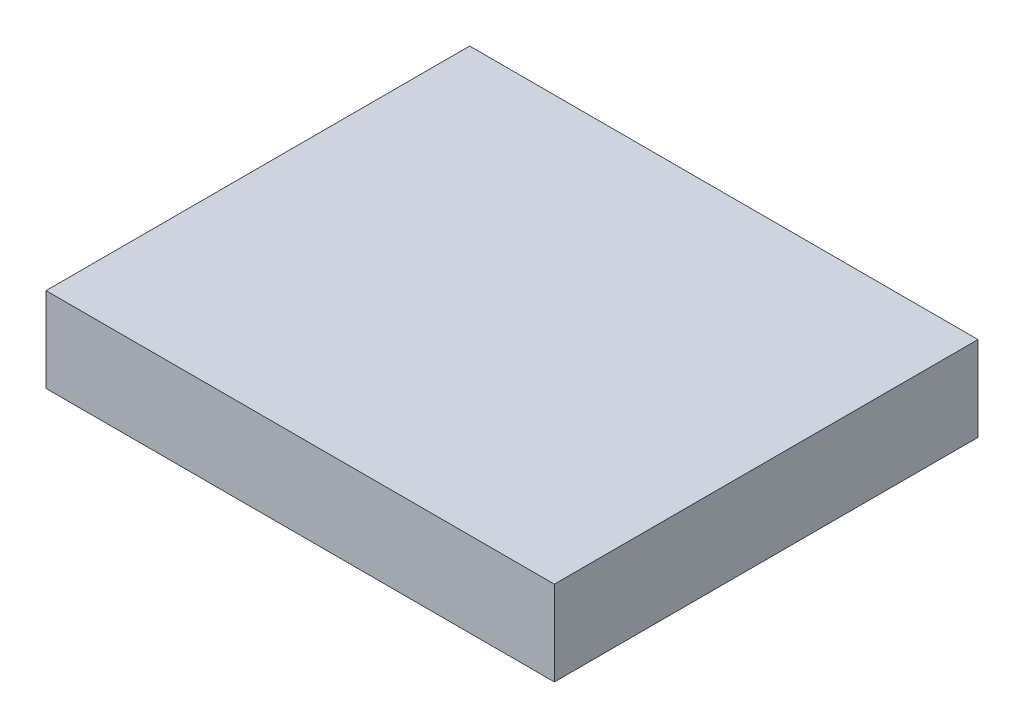
ISO-10303-21;
HEADER;
FILE_DESCRIPTION(('STEP AP214'),'2;1');
FILE_NAME('part.step','',(''),(''),'','','');
FILE_SCHEMA(('AUTOMOTIVE_DESIGN { 1 0 10303 214 1 1 1 1 }'));
ENDSEC;
DATA;
#1=APPLICATION_CONTEXT('core data for automotive mechanical design processes');
#2=APPLICATION_PROTOCOL_DEFINITION('international standard','automotive_design',2000,#1);
#3=PRODUCT_CONTEXT('',#1,'mechanical');
#4=PRODUCT('Part','Part','',(#3));
#5=PRODUCT_RELATED_PRODUCT_CATEGORY('part','',(#4));
#6=PRODUCT_DEFINITION_FORMATION('','',#4);
#7=PRODUCT_DEFINITION_CONTEXT('part definition',#1,'design');
#8=PRODUCT_DEFINITION('design','',#6,#7);
#9=PRODUCT_DEFINITION_SHAPE('','',#8);
#10=(LENGTH_UNIT() NAMED_UNIT(*) SI_UNIT(.MILLI.,.METRE.));
#11=(NAMED_UNIT(*) PLANE_ANGLE_UNIT() SI_UNIT($,.RADIAN.));
#12=(NAMED_UNIT(*) SI_UNIT($,.STERADIAN.) SOLID_ANGLE_UNIT());
#13=UNCERTAINTY_MEASURE_WITH_UNIT(LENGTH_MEASURE(1.E-05),#10,'distance_accuracy_value','');
#14=(GEOMETRIC_REPRESENTATION_CONTEXT(3) GLOBAL_UNCERTAINTY_ASSIGNED_CONTEXT((#13)) GLOBAL_UNIT_ASSIGNED_CONTEXT((#10,
#11,#12)) REPRESENTATION_CONTEXT('',''));
#15=CARTESIAN_POINT('',(0.,0.,0.));
#16=DIRECTION('',(0.,0.,1.));
#17=DIRECTION('',(1.,0.,0.));
#18=AXIS2_PLACEMENT_3D('',#15,#16,#17);
#19=CARTESIAN_POINT('',(-91.3911622123575,12.7,-43.7593276694763));
#20=DIRECTION('',(1.,0.,0.));
#21=DIRECTION('',(0.,0.,-1.));
#22=AXIS2_PLACEMENT_3D('',#19,#20,#21);
#23=PLANE('',#22);
#24=DIRECTION('',(0.,0.,1.));
#25=VECTOR('',#24,1.);
#26=CARTESIAN_POINT('',(-91.3911622123575,0.,-43.7593276694763));
#27=LINE('',#26,#25);
#28=CARTESIAN_POINT('',(-91.3911622123575,0.,-43.7593276694763));
#29=VERTEX_POINT('',#28);
#30=CARTESIAN_POINT('',(-91.3911622123575,0.,19.7406723305237));
#31=VERTEX_POINT('',#30);
#32=EDGE_CURVE('E97',#29,#31,#27,.T.);
#33=ORIENTED_EDGE('',*,*,#32,.T.);
#34=DIRECTION('',(0.,-1.,0.));
#35=VECTOR('',#34,1.);
#36=CARTESIAN_POINT('',(-91.3911622123575,12.7,19.7406723305237));
#37=LINE('',#36,#35);
#38=CARTESIAN_POINT('',(-91.3911622123575,12.7,19.7406723305237));
#39=VERTEX_POINT('',#38);
#40=EDGE_CURVE('E11',#39,#31,#37,.T.);
#41=ORIENTED_EDGE('',*,*,#40,.F.);
#42=DIRECTION('',(0.,0.,1.));
#43=VECTOR('',#42,1.);
#44=CARTESIAN_POINT('',(-91.3911622123575,12.7,-43.7593276694763));
#45=LINE('',#44,#43);
#46=CARTESIAN_POINT('',(-91.3911622123575,12.7,-43.7593276694763));
#47=VERTEX_POINT('',#46);
#48=EDGE_CURVE('E85',#47,#39,#45,.T.);
#49=ORIENTED_EDGE('',*,*,#48,.F.);
#50=DIRECTION('',(0.,-1.,0.));
#51=VECTOR('',#50,1.);
#52=CARTESIAN_POINT('',(-91.3911622123575,12.7,-43.7593276694763));
#53=LINE('',#52,#51);
#54=EDGE_CURVE('E93',#47,#29,#53,.T.);
#55=ORIENTED_EDGE('',*,*,#54,.T.);
#56=EDGE_LOOP('',(#33,#41,#49,#55));
#57=FACE_BOUND('',#56,.T.);
#58=ADVANCED_FACE('F34',(#57),#23,.F.);
#59=CARTESIAN_POINT('',(-91.3911622123575,12.7,19.7406723305237));
#60=DIRECTION('',(0.,0.,-1.));
#61=DIRECTION('',(-1.,0.,0.));
#62=AXIS2_PLACEMENT_3D('',#59,#60,#61);
#63=PLANE('',#62);
#64=DIRECTION('',(1.,0.,0.));
#65=VECTOR('',#64,1.);
#66=CARTESIAN_POINT('',(-91.3911622123575,0.,19.7406723305237));
#67=LINE('',#66,#65);
#68=CARTESIAN_POINT('',(-15.1911622123575,0.,19.7406723305237));
#69=VERTEX_POINT('',#68);
#70=EDGE_CURVE('E89',#31,#69,#67,.T.);
#71=ORIENTED_EDGE('',*,*,#70,.T.);
#72=DIRECTION('',(0.,-1.,0.));
#73=VECTOR('',#72,1.);
#74=CARTESIAN_POINT('',(-15.1911622123575,12.7,19.7406723305237));
#75=LINE('',#74,#73);
#76=CARTESIAN_POINT('',(-15.1911622123575,12.7,19.7406723305237));
#77=VERTEX_POINT('',#76);
#78=EDGE_CURVE('E42',#77,#69,#75,.T.);
#79=ORIENTED_EDGE('',*,*,#78,.F.);
#80=DIRECTION('',(1.,0.,0.));
#81=VECTOR('',#80,1.);
#82=CARTESIAN_POINT('',(-91.3911622123575,12.7,19.7406723305237));
#83=LINE('',#82,#81);
#84=EDGE_CURVE('E80',#39,#77,#83,.T.);
#85=ORIENTED_EDGE('',*,*,#84,.F.);
#86=ORIENTED_EDGE('',*,*,#40,.T.);
#87=EDGE_LOOP('',(#71,#79,#85,#86));
#88=FACE_BOUND('',#87,.T.);
#89=ADVANCED_FACE('F88',(#88),#63,.F.);
#90=CARTESIAN_POINT('',(-15.1911622123575,12.7,-43.7593276694763));
#91=DIRECTION('',(-1.,0.,0.));
#92=DIRECTION('',(0.,0.,1.));
#93=AXIS2_PLACEMENT_3D('',#90,#91,#92);
#94=PLANE('',#93);
#95=DIRECTION('',(0.,0.,-1.));
#96=VECTOR('',#95,1.);
#97=CARTESIAN_POINT('',(-15.1911622123575,0.,-43.7593276694763));
#98=LINE('',#97,#96);
#99=CARTESIAN_POINT('',(-15.1911622123575,0.,-43.7593276694763));
#100=VERTEX_POINT('',#99);
#101=EDGE_CURVE('E67',#69,#100,#98,.T.);
#102=ORIENTED_EDGE('',*,*,#101,.T.);
#103=DIRECTION('',(0.,-1.,0.));
#104=VECTOR('',#103,1.);
#105=CARTESIAN_POINT('',(-15.1911622123575,12.7,-43.7593276694763));
#106=LINE('',#105,#104);
#107=CARTESIAN_POINT('',(-15.1911622123575,12.7,-43.7593276694763));
#108=VERTEX_POINT('',#107);
#109=EDGE_CURVE('E90',#108,#100,#106,.T.);
#110=ORIENTED_EDGE('',*,*,#109,.F.);
#111=DIRECTION('',(0.,0.,-1.));
#112=VECTOR('',#111,1.);
#113=CARTESIAN_POINT('',(-15.1911622123575,12.7,-43.7593276694763));
#114=LINE('',#113,#112);
#115=EDGE_CURVE('E83',#77,#108,#114,.T.);
#116=ORIENTED_EDGE('',*,*,#115,.F.);
#117=ORIENTED_EDGE('',*,*,#78,.T.);
#118=EDGE_LOOP('',(#102,#110,#116,#117));
#119=FACE_BOUND('',#118,.T.);
#120=ADVANCED_FACE('F91',(#119),#94,.F.);
#121=CARTESIAN_POINT('',(-91.3911622123575,12.7,-43.7593276694763));
#122=DIRECTION('',(0.,0.,1.));
#123=DIRECTION('',(1.,0.,0.));
#124=AXIS2_PLACEMENT_3D('',#121,#122,#123);
#125=PLANE('',#124);
#126=DIRECTION('',(-1.,0.,0.));
#127=VECTOR('',#126,1.);
#128=CARTESIAN_POINT('',(-91.3911622123575,0.,-43.7593276694763));
#129=LINE('',#128,#127);
#130=EDGE_CURVE('E73',#100,#29,#129,.T.);
#131=ORIENTED_EDGE('',*,*,#130,.T.);
#132=ORIENTED_EDGE('',*,*,#54,.F.);
#133=DIRECTION('',(-1.,0.,0.));
#134=VECTOR('',#133,1.);
#135=CARTESIAN_POINT('',(-91.3911622123575,12.7,-43.7593276694763));
#136=LINE('',#135,#134);
#137=EDGE_CURVE('E50',#108,#47,#136,.T.);
#138=ORIENTED_EDGE('',*,*,#137,.F.);
#139=ORIENTED_EDGE('',*,*,#109,.T.);
#140=EDGE_LOOP('',(#131,#132,#138,#139));
#141=FACE_BOUND('',#140,.T.);
#142=ADVANCED_FACE('F104',(#141),#125,.F.);
#143=CARTESIAN_POINT('',(-91.3911622123575,12.7,19.7406723305237));
#144=DIRECTION('',(0.,1.,0.));
#145=DIRECTION('',(0.,0.,1.));
#146=AXIS2_PLACEMENT_3D('',#143,#144,#145);
#147=PLANE('',#146);
#148=ORIENTED_EDGE('',*,*,#48,.T.);
#149=ORIENTED_EDGE('',*,*,#84,.T.);
#150=ORIENTED_EDGE('',*,*,#115,.T.);
#151=ORIENTED_EDGE('',*,*,#137,.T.);
#152=EDGE_LOOP('',(#148,#149,#150,#151));
#153=FACE_BOUND('',#152,.T.);
#154=ADVANCED_FACE('F81',(#153),#147,.T.);
#155=CARTESIAN_POINT('',(-91.3911622123575,0.,19.7406723305237));
#156=DIRECTION('',(0.,1.,0.));
#157=DIRECTION('',(0.,0.,1.));
#158=AXIS2_PLACEMENT_3D('',#155,#156,#157);
#159=PLANE('',#158);
#160=ORIENTED_EDGE('',*,*,#32,.F.);
#161=ORIENTED_EDGE('',*,*,#130,.F.);
#162=ORIENTED_EDGE('',*,*,#101,.F.);
#163=ORIENTED_EDGE('',*,*,#70,.F.);
#164=EDGE_LOOP('',(#160,#161,#162,#163));
#165=FACE_BOUND('',#164,.T.);
#166=ADVANCED_FACE('F107',(#165),#159,.F.);
#167=CLOSED_SHELL('',(#58,#89,#120,#142,#154,#166));
#168=MANIFOLD_SOLID_BREP('B2',#167);
#169=ADVANCED_BREP_SHAPE_REPRESENTATION('',(#18,#168),#14);
#170=SHAPE_DEFINITION_REPRESENTATION(#9,#169);
ENDSEC;
END-ISO-10303-21;
